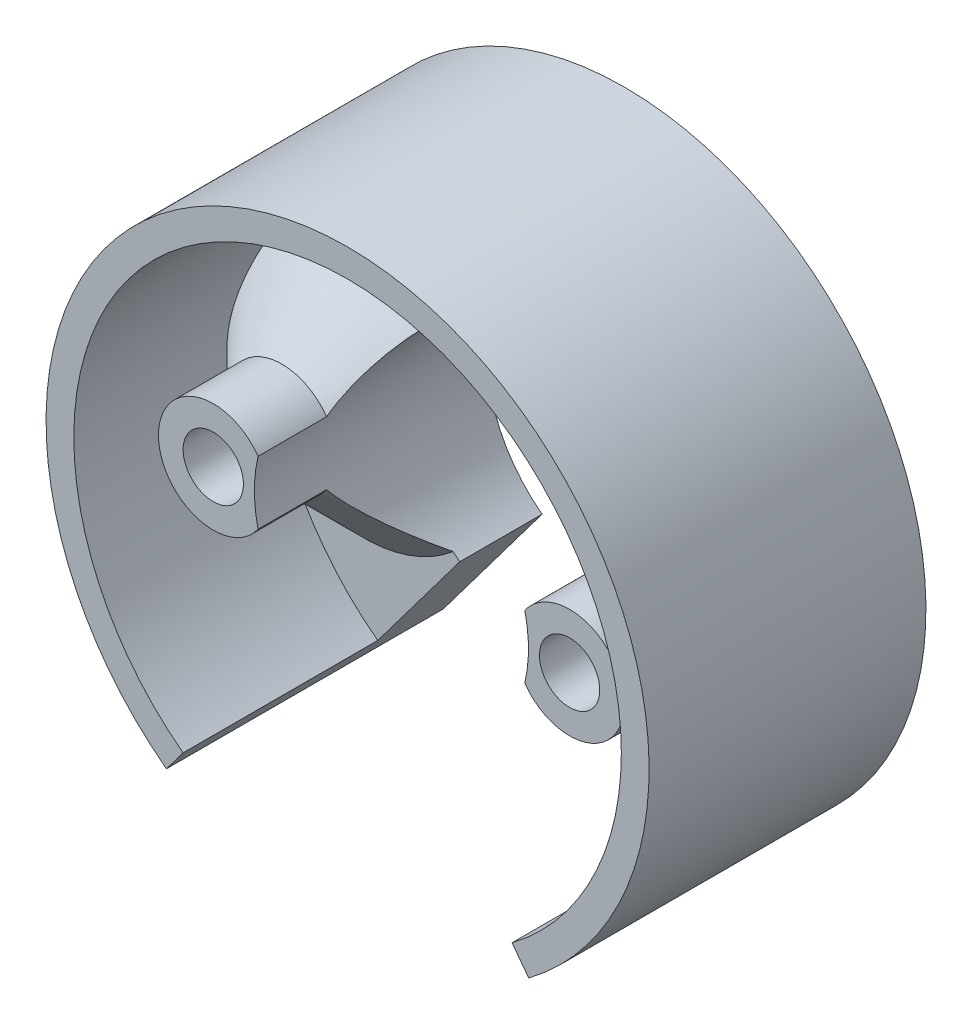
ISO-10303-21;
HEADER;
FILE_DESCRIPTION(('STEP AP214'),'2;1');
FILE_NAME('part.step','',(''),(''),'','','');
FILE_SCHEMA(('AUTOMOTIVE_DESIGN { 1 0 10303 214 1 1 1 1 }'));
ENDSEC;
DATA;
#1=APPLICATION_CONTEXT('core data for automotive mechanical design processes');
#2=APPLICATION_PROTOCOL_DEFINITION('international standard','automotive_design',2000,#1);
#3=PRODUCT_CONTEXT('',#1,'mechanical');
#4=PRODUCT('Part','Part','',(#3));
#5=PRODUCT_RELATED_PRODUCT_CATEGORY('part','',(#4));
#6=PRODUCT_DEFINITION_FORMATION('','',#4);
#7=PRODUCT_DEFINITION_CONTEXT('part definition',#1,'design');
#8=PRODUCT_DEFINITION('design','',#6,#7);
#9=PRODUCT_DEFINITION_SHAPE('','',#8);
#10=(LENGTH_UNIT() NAMED_UNIT(*) SI_UNIT(.MILLI.,.METRE.));
#11=(NAMED_UNIT(*) PLANE_ANGLE_UNIT() SI_UNIT($,.RADIAN.));
#12=(NAMED_UNIT(*) SI_UNIT($,.STERADIAN.) SOLID_ANGLE_UNIT());
#13=UNCERTAINTY_MEASURE_WITH_UNIT(LENGTH_MEASURE(1.E-05),#10,'distance_accuracy_value','');
#14=(GEOMETRIC_REPRESENTATION_CONTEXT(3) GLOBAL_UNCERTAINTY_ASSIGNED_CONTEXT((#13)) GLOBAL_UNIT_ASSIGNED_CONTEXT((#10,
#11,#12)) REPRESENTATION_CONTEXT('',''));
#15=CARTESIAN_POINT('',(0.,0.,0.));
#16=DIRECTION('',(0.,0.,1.));
#17=DIRECTION('',(1.,0.,0.));
#18=AXIS2_PLACEMENT_3D('',#15,#16,#17);
#19=CARTESIAN_POINT('',(0.,0.,3.));
#20=DIRECTION('',(0.,0.,1.));
#21=DIRECTION('',(1.,0.,0.));
#22=AXIS2_PLACEMENT_3D('',#19,#20,#21);
#23=PLANE('',#22);
#24=DIRECTION('',(-0.600761748195803,-0.799428121787521,0.));
#25=VECTOR('',#24,1.);
#26=CARTESIAN_POINT('',(0.,0.,3.));
#27=LINE('',#26,#25);
#28=CARTESIAN_POINT('',(-3.00380874097901,-3.9971406089376,3.));
#29=VERTEX_POINT('',#28);
#30=CARTESIAN_POINT('',(-5.99999999999994,-7.98414470483524,3.));
#31=VERTEX_POINT('',#30);
#32=EDGE_CURVE('E321',#29,#31,#27,.T.);
#33=ORIENTED_EDGE('',*,*,#32,.F.);
#34=CARTESIAN_POINT('',(0.,0.,3.));
#35=DIRECTION('',(0.,0.,1.));
#36=DIRECTION('',(1.,0.,0.));
#37=AXIS2_PLACEMENT_3D('',#34,#35,#36);
#38=CIRCLE('',#37,5.);
#39=CARTESIAN_POINT('',(-3.24999999999998,-3.79967103839268,3.));
#40=VERTEX_POINT('',#39);
#41=EDGE_CURVE('E182',#40,#29,#38,.T.);
#42=ORIENTED_EDGE('',*,*,#41,.F.);
#43=CARTESIAN_POINT('',(-6.5,0.,3.));
#44=DIRECTION('',(0.,0.,1.));
#45=DIRECTION('',(1.,0.,0.));
#46=AXIS2_PLACEMENT_3D('',#43,#44,#45);
#47=CIRCLE('',#46,5.00000000000002);
#48=CARTESIAN_POINT('',(-8.99973589751906,-4.33027948782232,3.));
#49=VERTEX_POINT('',#48);
#50=EDGE_CURVE('E199',#40,#49,#47,.F.);
#51=ORIENTED_EDGE('',*,*,#50,.T.);
#52=CARTESIAN_POINT('',(0.,0.,3.));
#53=DIRECTION('',(0.,0.,-1.));
#54=DIRECTION('',(1.,0.,0.));
#55=AXIS2_PLACEMENT_3D('',#52,#53,#54);
#56=CIRCLE('',#55,9.987320294641);
#57=EDGE_CURVE('E323',#31,#49,#56,.T.);
#58=ORIENTED_EDGE('',*,*,#57,.F.);
#59=EDGE_LOOP('',(#33,#42,#51,#58));
#60=FACE_BOUND('',#59,.T.);
#61=ADVANCED_FACE('F45',(#60),#23,.T.);
#62=CARTESIAN_POINT('',(3.24999999999998,3.79967103839268,3.));
#63=VERTEX_POINT('',#62);
#64=CARTESIAN_POINT('',(-3.24999999999998,3.79967103839268,3.));
#65=VERTEX_POINT('',#64);
#66=EDGE_CURVE('E184',#63,#65,#38,.T.);
#67=ORIENTED_EDGE('',*,*,#66,.F.);
#68=CARTESIAN_POINT('',(6.5,0.,3.));
#69=DIRECTION('',(0.,0.,1.));
#70=DIRECTION('',(1.,0.,0.));
#71=AXIS2_PLACEMENT_3D('',#68,#69,#70);
#72=CIRCLE('',#71,5.00000000000002);
#73=CARTESIAN_POINT('',(8.99973589751906,4.33027948782232,3.));
#74=VERTEX_POINT('',#73);
#75=EDGE_CURVE('E206',#63,#74,#72,.F.);
#76=ORIENTED_EDGE('',*,*,#75,.T.);
#77=CARTESIAN_POINT('',(-8.99973589751906,4.33027948782232,3.));
#78=VERTEX_POINT('',#77);
#79=EDGE_CURVE('E315',#78,#74,#56,.T.);
#80=ORIENTED_EDGE('',*,*,#79,.F.);
#81=CARTESIAN_POINT('',(-6.5,0.,3.));
#82=DIRECTION('',(0.,0.,1.));
#83=DIRECTION('',(1.,0.,0.));
#84=AXIS2_PLACEMENT_3D('',#81,#82,#83);
#85=CIRCLE('',#84,5.00000000000002);
#86=EDGE_CURVE('E196',#78,#65,#85,.F.);
#87=ORIENTED_EDGE('',*,*,#86,.T.);
#88=EDGE_LOOP('',(#67,#76,#80,#87));
#89=FACE_BOUND('',#88,.T.);
#90=ADVANCED_FACE('F411',(#89),#23,.T.);
#91=DIRECTION('',(-0.600761748195808,0.799428121787517,0.));
#92=VECTOR('',#91,1.);
#93=CARTESIAN_POINT('',(0.,0.,3.));
#94=LINE('',#93,#92);
#95=CARTESIAN_POINT('',(6.,-7.9841447048352,3.));
#96=VERTEX_POINT('',#95);
#97=CARTESIAN_POINT('',(3.00380874097904,-3.99714060893758,3.));
#98=VERTEX_POINT('',#97);
#99=EDGE_CURVE('E76',#96,#98,#94,.T.);
#100=ORIENTED_EDGE('',*,*,#99,.F.);
#101=CARTESIAN_POINT('',(8.99973589751906,-4.33027948782232,3.));
#102=VERTEX_POINT('',#101);
#103=EDGE_CURVE('E313',#102,#96,#56,.T.);
#104=ORIENTED_EDGE('',*,*,#103,.F.);
#105=CARTESIAN_POINT('',(6.5,0.,3.));
#106=DIRECTION('',(0.,0.,1.));
#107=DIRECTION('',(1.,0.,0.));
#108=AXIS2_PLACEMENT_3D('',#105,#106,#107);
#109=CIRCLE('',#108,5.00000000000002);
#110=CARTESIAN_POINT('',(3.24999999999998,-3.79967103839268,3.));
#111=VERTEX_POINT('',#110);
#112=EDGE_CURVE('E202',#102,#111,#109,.F.);
#113=ORIENTED_EDGE('',*,*,#112,.T.);
#114=EDGE_CURVE('E176',#98,#111,#38,.T.);
#115=ORIENTED_EDGE('',*,*,#114,.F.);
#116=EDGE_LOOP('',(#100,#104,#113,#115));
#117=FACE_BOUND('',#116,.T.);
#118=ADVANCED_FACE('F261',(#117),#23,.T.);
#119=CARTESIAN_POINT('',(0.,0.,0.));
#120=DIRECTION('',(0.,0.,1.));
#121=DIRECTION('',(1.,0.,0.));
#122=AXIS2_PLACEMENT_3D('',#119,#120,#121);
#123=PLANE('',#122);
#124=CARTESIAN_POINT('',(0.,0.,0.));
#125=DIRECTION('',(0.,0.,1.));
#126=DIRECTION('',(1.,0.,0.));
#127=AXIS2_PLACEMENT_3D('',#124,#125,#126);
#128=CIRCLE('',#127,5.);
#129=CARTESIAN_POINT('',(3.00380874097904,-3.99714060893758,0.));
#130=VERTEX_POINT('',#129);
#131=CARTESIAN_POINT('',(-3.00380874097901,-3.9971406089376,0.));
#132=VERTEX_POINT('',#131);
#133=EDGE_CURVE('E167',#130,#132,#128,.T.);
#134=ORIENTED_EDGE('',*,*,#133,.T.);
#135=DIRECTION('',(0.600761748195802,0.799428121787521,0.));
#136=VECTOR('',#135,1.);
#137=CARTESIAN_POINT('',(0.,0.,0.));
#138=LINE('',#137,#136);
#139=CARTESIAN_POINT('',(-6.60837923015383,-8.79370933966273,0.));
#140=VERTEX_POINT('',#139);
#141=EDGE_CURVE('E68',#140,#132,#138,.T.);
#142=ORIENTED_EDGE('',*,*,#141,.F.);
#143=CARTESIAN_POINT('',(0.,0.,0.));
#144=DIRECTION('',(0.,0.,1.));
#145=DIRECTION('',(1.,0.,0.));
#146=AXIS2_PLACEMENT_3D('',#143,#144,#145);
#147=CIRCLE('',#146,11.);
#148=CARTESIAN_POINT('',(6.60837923015389,-8.79370933966268,0.));
#149=VERTEX_POINT('',#148);
#150=EDGE_CURVE('E169',#149,#140,#147,.T.);
#151=ORIENTED_EDGE('',*,*,#150,.F.);
#152=DIRECTION('',(0.600761748195808,-0.799428121787517,0.));
#153=VECTOR('',#152,1.);
#154=CARTESIAN_POINT('',(0.,0.,0.));
#155=LINE('',#154,#153);
#156=EDGE_CURVE('E155',#130,#149,#155,.T.);
#157=ORIENTED_EDGE('',*,*,#156,.F.);
#158=EDGE_LOOP('',(#134,#142,#151,#157));
#159=FACE_BOUND('',#158,.T.);
#160=CARTESIAN_POINT('',(-6.5,0.,0.));
#161=DIRECTION('',(0.,0.,1.));
#162=DIRECTION('',(1.,0.,0.));
#163=AXIS2_PLACEMENT_3D('',#160,#161,#162);
#164=CIRCLE('',#163,1.1);
#165=CARTESIAN_POINT('',(-5.4,0.,0.));
#166=VERTEX_POINT('',#165);
#167=EDGE_CURVE('E177',#166,#166,#164,.T.);
#168=ORIENTED_EDGE('',*,*,#167,.T.);
#169=EDGE_LOOP('',(#168));
#170=FACE_BOUND('',#169,.T.);
#171=CARTESIAN_POINT('',(6.5,0.,0.));
#172=DIRECTION('',(0.,0.,1.));
#173=DIRECTION('',(1.,0.,0.));
#174=AXIS2_PLACEMENT_3D('',#171,#172,#173);
#175=CIRCLE('',#174,1.1);
#176=CARTESIAN_POINT('',(7.6,0.,0.));
#177=VERTEX_POINT('',#176);
#178=EDGE_CURVE('E187',#177,#177,#175,.T.);
#179=ORIENTED_EDGE('',*,*,#178,.T.);
#180=EDGE_LOOP('',(#179));
#181=FACE_BOUND('',#180,.T.);
#182=ADVANCED_FACE('F165',(#159,#170,#181),#123,.F.);
#183=CARTESIAN_POINT('',(0.,0.,3.));
#184=DIRECTION('',(0.,0.,-1.));
#185=DIRECTION('',(-1.,0.,0.));
#186=AXIS2_PLACEMENT_3D('',#183,#184,#185);
#187=CYLINDRICAL_SURFACE('',#186,11.);
#188=ORIENTED_EDGE('',*,*,#150,.T.);
#189=DIRECTION('',(0.,0.,-1.));
#190=VECTOR('',#189,1.);
#191=CARTESIAN_POINT('',(-6.60837923015389,-8.79370933966268,10.1));
#192=LINE('',#191,#190);
#193=CARTESIAN_POINT('',(-6.60837923015389,-8.79370933966268,10.1));
#194=VERTEX_POINT('',#193);
#195=EDGE_CURVE('E383',#194,#140,#192,.T.);
#196=ORIENTED_EDGE('',*,*,#195,.F.);
#197=CARTESIAN_POINT('',(0.,0.,10.1));
#198=DIRECTION('',(0.,0.,1.));
#199=DIRECTION('',(1.,0.,0.));
#200=AXIS2_PLACEMENT_3D('',#197,#198,#199);
#201=CIRCLE('',#200,11.);
#202=CARTESIAN_POINT('',(6.60837923015389,-8.79370933966268,10.1));
#203=VERTEX_POINT('',#202);
#204=EDGE_CURVE('E361',#203,#194,#201,.T.);
#205=ORIENTED_EDGE('',*,*,#204,.F.);
#206=DIRECTION('',(0.,0.,-1.));
#207=VECTOR('',#206,1.);
#208=CARTESIAN_POINT('',(6.60837923015389,-8.79370933966268,10.1));
#209=LINE('',#208,#207);
#210=EDGE_CURVE('E373',#203,#149,#209,.T.);
#211=ORIENTED_EDGE('',*,*,#210,.T.);
#212=EDGE_LOOP('',(#188,#196,#205,#211));
#213=FACE_BOUND('',#212,.T.);
#214=ADVANCED_FACE('F260',(#213),#187,.T.);
#215=CARTESIAN_POINT('',(0.,0.,3.));
#216=DIRECTION('',(0.,0.,-1.));
#217=DIRECTION('',(-1.,0.,0.));
#218=AXIS2_PLACEMENT_3D('',#215,#216,#217);
#219=CYLINDRICAL_SURFACE('',#218,5.);
#220=DIRECTION('',(0.,0.,-1.));
#221=VECTOR('',#220,1.);
#222=CARTESIAN_POINT('',(-3.00380874097901,-3.9971406089376,10.));
#223=LINE('',#222,#221);
#224=EDGE_CURVE('E161',#29,#132,#223,.T.);
#225=ORIENTED_EDGE('',*,*,#224,.T.);
#226=ORIENTED_EDGE('',*,*,#133,.F.);
#227=DIRECTION('',(0.,0.,-1.));
#228=VECTOR('',#227,1.);
#229=CARTESIAN_POINT('',(3.00380874097904,-3.99714060893758,10.));
#230=LINE('',#229,#228);
#231=EDGE_CURVE('E151',#98,#130,#230,.T.);
#232=ORIENTED_EDGE('',*,*,#231,.F.);
#233=ORIENTED_EDGE('',*,*,#114,.T.);
#234=CARTESIAN_POINT('',(3.24999999999998,-3.79967103839268,3.));
#235=CARTESIAN_POINT('',(3.31760602021216,-3.74184321252924,3.08788616162119));
#236=CARTESIAN_POINT('',(3.38354345836514,-3.68232198830534,3.1759241669716));
#237=CARTESIAN_POINT('',(3.51199944060858,-3.56001797404654,3.35222888387647));
#238=CARTESIAN_POINT('',(3.57451798486796,-3.49723518417279,3.44049559541962));
#239=CARTESIAN_POINT('',(3.75687393840086,-3.30412803550893,3.70560083192215));
#240=CARTESIAN_POINT('',(3.87145451622359,-3.16909387480187,3.88267021670122));
#241=CARTESIAN_POINT('',(4.08384424779871,-2.89005062852266,4.23302608860814));
#242=CARTESIAN_POINT('',(4.1819334010978,-2.74626390062699,4.406319877048));
#243=CARTESIAN_POINT('',(4.3180177202173,-2.52236785028849,4.66485177316896));
#244=CARTESIAN_POINT('',(4.36153499144014,-2.44637198868528,4.75078844148804));
#245=CARTESIAN_POINT('',(4.44482783822175,-2.29155727558712,4.92192411196014));
#246=CARTESIAN_POINT('',(4.48460379131815,-2.21273871004281,5.00712318775437));
#247=CARTESIAN_POINT('',(4.55785514464445,-2.05738661910028,5.17084124015878));
#248=CARTESIAN_POINT('',(4.59157270637921,-1.98104249508576,5.24943172456402));
#249=CARTESIAN_POINT('',(4.65559262768488,-1.82552200341731,5.40513084501972));
#250=CARTESIAN_POINT('',(4.68589651070962,-1.74634692011148,5.48224012925259));
#251=CARTESIAN_POINT('',(4.72885768869272,-1.62473782851321,5.59660137317794));
#252=CARTESIAN_POINT('',(4.74282011893764,-1.58353275859239,5.63467507951544));
#253=CARTESIAN_POINT('',(4.7698359301542,-1.50019467633801,5.71011893964536));
#254=CARTESIAN_POINT('',(4.78288938008276,-1.45806173471441,5.74748914664926));
#255=CARTESIAN_POINT('',(4.80807993917729,-1.37271687278439,5.82139387289693));
#256=CARTESIAN_POINT('',(4.82021608902512,-1.32950388410516,5.85792749015052));
#257=CARTESIAN_POINT('',(4.84352888997359,-1.24188348177952,5.92987230653889));
#258=CARTESIAN_POINT('',(4.8547052968318,-1.19747576784455,5.96528321852163));
#259=CARTESIAN_POINT('',(4.86538461538463,-1.15240294358304,6.00000000000011));
#260=B_SPLINE_CURVE_WITH_KNOTS('',3,(#234,#235,#236,#237,#238,#239,#240,#241,#242,#243,#244,
#245,#246,#247,#248,#249,#250,#251,#252,#253,#254,#255,#256,#257,#258,#259),.UNSPECIFIED.,.F.,
.F.,(4,2,2,2,2,2,2,2,2,2,2,2,4),(0.,0.375116764830293,0.750233511126938,1.50078334502235,
2.23690883678732,2.60492121844114,2.97289642391581,3.31672718752836,3.66040389357613,
3.83382953665474,4.00724200897719,4.18083339742028,4.35446883255692),.UNSPECIFIED.);
#261=CARTESIAN_POINT('',(4.86538461538461,-1.15240294358297,6.00000000000005));
#262=VERTEX_POINT('',#261);
#263=EDGE_CURVE('E273',#111,#262,#260,.T.);
#264=ORIENTED_EDGE('',*,*,#263,.T.);
#265=DIRECTION('',(0.,0.,-1.));
#266=VECTOR('',#265,1.);
#267=CARTESIAN_POINT('',(4.86538461538461,-1.15240294358297,8.5));
#268=LINE('',#267,#266);
#269=CARTESIAN_POINT('',(4.86538461538461,-1.15240294358297,8.5));
#270=VERTEX_POINT('',#269);
#271=EDGE_CURVE('E329',#270,#262,#268,.T.);
#272=ORIENTED_EDGE('',*,*,#271,.F.);
#273=CARTESIAN_POINT('',(0.,0.,8.5));
#274=DIRECTION('',(0.,0.,-1.));
#275=DIRECTION('',(1.,0.,0.));
#276=AXIS2_PLACEMENT_3D('',#273,#274,#275);
#277=CIRCLE('',#276,5.);
#278=CARTESIAN_POINT('',(4.86538461538461,1.15240294358297,8.5));
#279=VERTEX_POINT('',#278);
#280=EDGE_CURVE('E331',#279,#270,#277,.T.);
#281=ORIENTED_EDGE('',*,*,#280,.F.);
#282=DIRECTION('',(0.,0.,-1.));
#283=VECTOR('',#282,1.);
#284=CARTESIAN_POINT('',(4.86538461538461,1.15240294358297,8.5));
#285=LINE('',#284,#283);
#286=CARTESIAN_POINT('',(4.86538461538461,1.15240294358297,6.00000000000005));
#287=VERTEX_POINT('',#286);
#288=EDGE_CURVE('E327',#279,#287,#285,.T.);
#289=ORIENTED_EDGE('',*,*,#288,.T.);
#290=CARTESIAN_POINT('',(4.86538461538461,1.15240294358297,6.00000000000005));
#291=CARTESIAN_POINT('',(4.85666874846538,1.18919486511631,5.97166993095488));
#292=CARTESIAN_POINT('',(4.84762110268823,1.22553909889845,5.94287067726912));
#293=CARTESIAN_POINT('',(4.82888170570585,1.29741421029686,5.88448903351356));
#294=CARTESIAN_POINT('',(4.81919006098167,1.33294522107458,5.85490677339306));
#295=CARTESIAN_POINT('',(4.78918637227833,1.43841523011025,5.76524149311673));
#296=CARTESIAN_POINT('',(4.76793459269001,1.50727714538455,5.70420405016701));
#297=CARTESIAN_POINT('',(4.72305641778763,1.64249898267645,5.58047690181129));
#298=CARTESIAN_POINT('',(4.69943340413765,1.70886228726208,5.51778964085392));
#299=CARTESIAN_POINT('',(4.6498475546972,1.83950995651555,5.39116969129651));
#300=CARTESIAN_POINT('',(4.6238843005448,1.90379394666462,5.327236781621));
#301=CARTESIAN_POINT('',(4.54331632301094,2.09207137099102,5.13591667275861));
#302=CARTESIAN_POINT('',(4.48540125510619,2.21336940464067,5.00725329119695));
#303=CARTESIAN_POINT('',(4.36093102529069,2.44950579945845,4.74812015962299));
#304=CARTESIAN_POINT('',(4.2943722694846,2.5643414450513,4.61764967852114));
#305=CARTESIAN_POINT('',(4.15728184276057,2.78071340260311,4.36401294574114));
#306=CARTESIAN_POINT('',(4.08725709372787,2.88263246328362,4.2408988198785));
#307=CARTESIAN_POINT('',(3.9400497353427,3.08078477126456,3.99443618699191));
#308=CARTESIAN_POINT('',(3.86286886415137,3.17701939001926,3.8710877439742));
#309=CARTESIAN_POINT('',(3.70049906372417,3.36480513905538,3.62288873118914));
#310=CARTESIAN_POINT('',(3.61521935373222,3.45627945569276,3.49803940030966));
#311=CARTESIAN_POINT('',(3.43773677897362,3.63285376266675,3.24868331154885));
#312=CARTESIAN_POINT('',(3.34553192560978,3.71795190792525,3.12417666279271));
#313=CARTESIAN_POINT('',(3.24999999999997,3.79967103839269,3.00000000000002));
#314=B_SPLINE_CURVE_WITH_KNOTS('',3,(#290,#291,#292,#293,#294,#295,#296,#297,#298,#299,#300,
#301,#302,#303,#304,#305,#306,#307,#308,#309,#310,#311,#312,#313),.UNSPECIFIED.,.F.,.F.,(4,2,2,
2,2,2,2,2,2,2,2,4),(0.,0.141723523437728,0.283423671841019,0.566646152542504,0.849470312717236,
1.13234513368094,1.69016775581147,2.24822305794793,2.77146261020098,3.29457540330164,
3.82446423337607,4.35450581034724),.UNSPECIFIED.);
#315=EDGE_CURVE('E266',#287,#63,#314,.T.);
#316=ORIENTED_EDGE('',*,*,#315,.T.);
#317=ORIENTED_EDGE('',*,*,#66,.T.);
#318=CARTESIAN_POINT('',(-3.24999999999998,3.79967103839268,3.));
#319=CARTESIAN_POINT('',(-3.31760602021216,3.74184321252924,3.08788616162119));
#320=CARTESIAN_POINT('',(-3.38354345836514,3.68232198830533,3.1759241669716));
#321=CARTESIAN_POINT('',(-3.51199944060858,3.56001797404654,3.35222888387646));
#322=CARTESIAN_POINT('',(-3.57451798486796,3.49723518417279,3.44049559541962));
#323=CARTESIAN_POINT('',(-3.75687393840086,3.30412803550893,3.70560083192215));
#324=CARTESIAN_POINT('',(-3.87145451622359,3.16909387480187,3.88267021670122));
#325=CARTESIAN_POINT('',(-4.08384424779871,2.89005062852265,4.23302608860814));
#326=CARTESIAN_POINT('',(-4.1819334010978,2.74626390062699,4.406319877048));
#327=CARTESIAN_POINT('',(-4.3180177202173,2.52236785028849,4.66485177316896));
#328=CARTESIAN_POINT('',(-4.36153499144014,2.44637198868528,4.75078844148804));
#329=CARTESIAN_POINT('',(-4.44482783822175,2.29155727558712,4.92192411196015));
#330=CARTESIAN_POINT('',(-4.48460379131815,2.21273871004281,5.00712318775437));
#331=CARTESIAN_POINT('',(-4.55785514464444,2.05738661910028,5.17084124015878));
#332=CARTESIAN_POINT('',(-4.59157270637921,1.98104249508576,5.24943172456402));
#333=CARTESIAN_POINT('',(-4.65559262768488,1.82552200341731,5.40513084501972));
#334=CARTESIAN_POINT('',(-4.68589651070962,1.74634692011148,5.48224012925259));
#335=CARTESIAN_POINT('',(-4.72885768869272,1.62473782851321,5.59660137317794));
#336=CARTESIAN_POINT('',(-4.74282011893764,1.58353275859239,5.63467507951544));
#337=CARTESIAN_POINT('',(-4.7698359301542,1.50019467633801,5.71011893964536));
#338=CARTESIAN_POINT('',(-4.78288938008276,1.45806173471441,5.74748914664926));
#339=CARTESIAN_POINT('',(-4.80807993917729,1.37271687278439,5.82139387289693));
#340=CARTESIAN_POINT('',(-4.82021608902512,1.32950388410516,5.85792749015052));
#341=CARTESIAN_POINT('',(-4.84352888997359,1.24188348177952,5.92987230653889));
#342=CARTESIAN_POINT('',(-4.8547052968318,1.19747576784455,5.96528321852163));
#343=CARTESIAN_POINT('',(-4.86538461538463,1.15240294358304,6.00000000000011));
#344=B_SPLINE_CURVE_WITH_KNOTS('',3,(#318,#319,#320,#321,#322,#323,#324,#325,#326,#327,#328,
#329,#330,#331,#332,#333,#334,#335,#336,#337,#338,#339,#340,#341,#342,#343),.UNSPECIFIED.,.F.,
.F.,(4,2,2,2,2,2,2,2,2,2,2,2,4),(0.,0.375116764830293,0.750233511126938,1.50078334502235,
2.23690883678732,2.60492121844114,2.97289642391581,3.31672718752837,3.66040389357613,
3.83382953665474,4.00724200897719,4.18083339742028,4.35446883255692),.UNSPECIFIED.);
#345=CARTESIAN_POINT('',(-4.86538461538461,1.15240294358297,6.00000000000005));
#346=VERTEX_POINT('',#345);
#347=EDGE_CURVE('E11',#65,#346,#344,.T.);
#348=ORIENTED_EDGE('',*,*,#347,.T.);
#349=DIRECTION('',(0.,0.,-1.));
#350=VECTOR('',#349,1.);
#351=CARTESIAN_POINT('',(-4.86538461538461,1.15240294358297,8.5));
#352=LINE('',#351,#350);
#353=CARTESIAN_POINT('',(-4.86538461538461,1.15240294358297,8.5));
#354=VERTEX_POINT('',#353);
#355=EDGE_CURVE('E393',#354,#346,#352,.T.);
#356=ORIENTED_EDGE('',*,*,#355,.F.);
#357=CARTESIAN_POINT('',(0.,0.,8.5));
#358=DIRECTION('',(0.,0.,-1.));
#359=DIRECTION('',(1.,0.,0.));
#360=AXIS2_PLACEMENT_3D('',#357,#358,#359);
#361=CIRCLE('',#360,5.);
#362=CARTESIAN_POINT('',(-4.86538461538461,-1.15240294358297,8.5));
#363=VERTEX_POINT('',#362);
#364=EDGE_CURVE('E385',#363,#354,#361,.T.);
#365=ORIENTED_EDGE('',*,*,#364,.F.);
#366=DIRECTION('',(0.,0.,-1.));
#367=VECTOR('',#366,1.);
#368=CARTESIAN_POINT('',(-4.86538461538461,-1.15240294358297,8.5));
#369=LINE('',#368,#367);
#370=CARTESIAN_POINT('',(-4.86538461538461,-1.15240294358297,6.00000000000005));
#371=VERTEX_POINT('',#370);
#372=EDGE_CURVE('E391',#363,#371,#369,.T.);
#373=ORIENTED_EDGE('',*,*,#372,.T.);
#374=CARTESIAN_POINT('',(-4.86538461538461,-1.15240294358297,6.00000000000005));
#375=CARTESIAN_POINT('',(-4.85666874846538,-1.18919486511631,5.97166993095488));
#376=CARTESIAN_POINT('',(-4.84762110268823,-1.22553909889845,5.94287067726912));
#377=CARTESIAN_POINT('',(-4.82888170570585,-1.29741421029686,5.88448903351356));
#378=CARTESIAN_POINT('',(-4.81919006098167,-1.33294522107458,5.85490677339306));
#379=CARTESIAN_POINT('',(-4.78918637227833,-1.43841523011025,5.76524149311673));
#380=CARTESIAN_POINT('',(-4.76793459269001,-1.50727714538455,5.70420405016701));
#381=CARTESIAN_POINT('',(-4.72305641778763,-1.64249898267645,5.58047690181129));
#382=CARTESIAN_POINT('',(-4.69943340413765,-1.70886228726208,5.51778964085392));
#383=CARTESIAN_POINT('',(-4.6498475546972,-1.83950995651555,5.39116969129651));
#384=CARTESIAN_POINT('',(-4.6238843005448,-1.90379394666462,5.327236781621));
#385=CARTESIAN_POINT('',(-4.54331632301094,-2.09207137099102,5.13591667275861));
#386=CARTESIAN_POINT('',(-4.48540125510619,-2.21336940464067,5.00725329119695));
#387=CARTESIAN_POINT('',(-4.36093102529069,-2.44950579945845,4.74812015962299));
#388=CARTESIAN_POINT('',(-4.2943722694846,-2.5643414450513,4.61764967852114));
#389=CARTESIAN_POINT('',(-4.15728184276057,-2.78071340260311,4.36401294574114));
#390=CARTESIAN_POINT('',(-4.08725709372787,-2.88263246328362,4.2408988198785));
#391=CARTESIAN_POINT('',(-3.9400497353427,-3.08078477126456,3.99443618699191));
#392=CARTESIAN_POINT('',(-3.86286886415137,-3.17701939001926,3.8710877439742));
#393=CARTESIAN_POINT('',(-3.70049906372417,-3.36480513905538,3.62288873118914));
#394=CARTESIAN_POINT('',(-3.61521935373222,-3.45627945569276,3.49803940030966));
#395=CARTESIAN_POINT('',(-3.43773677897362,-3.63285376266675,3.24868331154885));
#396=CARTESIAN_POINT('',(-3.34553192560978,-3.71795190792525,3.12417666279271));
#397=CARTESIAN_POINT('',(-3.24999999999997,-3.79967103839269,3.00000000000002));
#398=B_SPLINE_CURVE_WITH_KNOTS('',3,(#374,#375,#376,#377,#378,#379,#380,#381,#382,#383,#384,
#385,#386,#387,#388,#389,#390,#391,#392,#393,#394,#395,#396,#397),.UNSPECIFIED.,.F.,.F.,(4,2,2,
2,2,2,2,2,2,2,2,4),(0.,0.141723523437728,0.283423671841019,0.566646152542504,0.849470312717236,
1.13234513368094,1.69016775581147,2.24822305794793,2.77146261020098,3.29457540330164,
3.82446423337608,4.35450581034724),.UNSPECIFIED.);
#399=EDGE_CURVE('E61',#371,#40,#398,.T.);
#400=ORIENTED_EDGE('',*,*,#399,.T.);
#401=ORIENTED_EDGE('',*,*,#41,.T.);
#402=EDGE_LOOP('',(#225,#226,#232,#233,#264,#272,#281,#289,#316,#317,#348,#356,#365,#373,#400,#401));
#403=FACE_BOUND('',#402,.T.);
#404=ADVANCED_FACE('F173',(#403),#219,.F.);
#405=CARTESIAN_POINT('',(-6.5,0.,3.));
#406=DIRECTION('',(0.,0.,-1.));
#407=DIRECTION('',(-1.,0.,0.));
#408=AXIS2_PLACEMENT_3D('',#405,#406,#407);
#409=CYLINDRICAL_SURFACE('',#408,1.1);
#410=ORIENTED_EDGE('',*,*,#167,.F.);
#411=EDGE_LOOP('',(#410));
#412=FACE_BOUND('',#411,.T.);
#413=CARTESIAN_POINT('',(-6.5,0.,8.5));
#414=DIRECTION('',(0.,0.,1.));
#415=DIRECTION('',(1.,0.,0.));
#416=AXIS2_PLACEMENT_3D('',#413,#414,#415);
#417=CIRCLE('',#416,1.1);
#418=CARTESIAN_POINT('',(-5.4,0.,8.5));
#419=VERTEX_POINT('',#418);
#420=EDGE_CURVE('E171',#419,#419,#417,.F.);
#421=ORIENTED_EDGE('',*,*,#420,.F.);
#422=EDGE_LOOP('',(#421));
#423=FACE_BOUND('',#422,.T.);
#424=ADVANCED_FACE('F253',(#412,#423),#409,.F.);
#425=CARTESIAN_POINT('',(6.5,0.,3.));
#426=DIRECTION('',(0.,0.,-1.));
#427=DIRECTION('',(-1.,0.,0.));
#428=AXIS2_PLACEMENT_3D('',#425,#426,#427);
#429=CYLINDRICAL_SURFACE('',#428,1.1);
#430=ORIENTED_EDGE('',*,*,#178,.F.);
#431=EDGE_LOOP('',(#430));
#432=FACE_BOUND('',#431,.T.);
#433=CARTESIAN_POINT('',(6.5,0.,8.5));
#434=DIRECTION('',(0.,0.,1.));
#435=DIRECTION('',(1.,0.,0.));
#436=AXIS2_PLACEMENT_3D('',#433,#434,#435);
#437=CIRCLE('',#436,1.1);
#438=CARTESIAN_POINT('',(7.6,0.,8.5));
#439=VERTEX_POINT('',#438);
#440=EDGE_CURVE('E347',#439,#439,#437,.F.);
#441=ORIENTED_EDGE('',*,*,#440,.F.);
#442=EDGE_LOOP('',(#441));
#443=FACE_BOUND('',#442,.T.);
#444=ADVANCED_FACE('F246',(#432,#443),#429,.F.);
#445=CARTESIAN_POINT('',(3.25,0.,8.5));
#446=DIRECTION('',(0.,0.,1.));
#447=DIRECTION('',(1.,0.,0.));
#448=AXIS2_PLACEMENT_3D('',#445,#446,#447);
#449=PLANE('',#448);
#450=ORIENTED_EDGE('',*,*,#440,.T.);
#451=EDGE_LOOP('',(#450));
#452=FACE_BOUND('',#451,.T.);
#453=ORIENTED_EDGE('',*,*,#280,.T.);
#454=CARTESIAN_POINT('',(6.5,0.,8.5));
#455=DIRECTION('',(0.,0.,1.));
#456=DIRECTION('',(1.,0.,0.));
#457=AXIS2_PLACEMENT_3D('',#454,#455,#456);
#458=CIRCLE('',#457,2.);
#459=EDGE_CURVE('E333',#270,#279,#458,.T.);
#460=ORIENTED_EDGE('',*,*,#459,.T.);
#461=EDGE_LOOP('',(#453,#460));
#462=FACE_BOUND('',#461,.T.);
#463=ADVANCED_FACE('F243',(#452,#462),#449,.T.);
#464=CARTESIAN_POINT('',(6.5,0.,8.5));
#465=DIRECTION('',(0.,0.,-1.));
#466=DIRECTION('',(-1.,0.,0.));
#467=AXIS2_PLACEMENT_3D('',#464,#465,#466);
#468=CYLINDRICAL_SURFACE('',#467,2.);
#469=ORIENTED_EDGE('',*,*,#271,.T.);
#470=CARTESIAN_POINT('',(6.5,0.,6.00000000000005));
#471=DIRECTION('',(0.,0.,1.));
#472=DIRECTION('',(1.,0.,0.));
#473=AXIS2_PLACEMENT_3D('',#470,#471,#472);
#474=CIRCLE('',#473,2.);
#475=EDGE_CURVE('E192',#262,#287,#474,.T.);
#476=ORIENTED_EDGE('',*,*,#475,.T.);
#477=ORIENTED_EDGE('',*,*,#288,.F.);
#478=ORIENTED_EDGE('',*,*,#459,.F.);
#479=EDGE_LOOP('',(#469,#476,#477,#478));
#480=FACE_BOUND('',#479,.T.);
#481=ADVANCED_FACE('F241',(#480),#468,.T.);
#482=CARTESIAN_POINT('',(-6.5,0.,8.5));
#483=DIRECTION('',(0.,0.,-1.));
#484=DIRECTION('',(-1.,0.,0.));
#485=AXIS2_PLACEMENT_3D('',#482,#483,#484);
#486=CYLINDRICAL_SURFACE('',#485,2.);
#487=ORIENTED_EDGE('',*,*,#355,.T.);
#488=CARTESIAN_POINT('',(-6.5,0.,6.00000000000005));
#489=DIRECTION('',(0.,0.,1.));
#490=DIRECTION('',(1.,0.,0.));
#491=AXIS2_PLACEMENT_3D('',#488,#489,#490);
#492=CIRCLE('',#491,2.);
#493=EDGE_CURVE('E293',#346,#371,#492,.T.);
#494=ORIENTED_EDGE('',*,*,#493,.T.);
#495=ORIENTED_EDGE('',*,*,#372,.F.);
#496=CARTESIAN_POINT('',(-6.5,0.,8.5));
#497=DIRECTION('',(0.,0.,1.));
#498=DIRECTION('',(1.,0.,0.));
#499=AXIS2_PLACEMENT_3D('',#496,#497,#498);
#500=CIRCLE('',#499,2.);
#501=EDGE_CURVE('E389',#354,#363,#500,.T.);
#502=ORIENTED_EDGE('',*,*,#501,.F.);
#503=EDGE_LOOP('',(#487,#494,#495,#502));
#504=FACE_BOUND('',#503,.T.);
#505=ADVANCED_FACE('F237',(#504),#486,.T.);
#506=CARTESIAN_POINT('',(-3.25,0.,8.5));
#507=DIRECTION('',(0.,0.,1.));
#508=DIRECTION('',(1.,0.,0.));
#509=AXIS2_PLACEMENT_3D('',#506,#507,#508);
#510=PLANE('',#509);
#511=ORIENTED_EDGE('',*,*,#420,.T.);
#512=EDGE_LOOP('',(#511));
#513=FACE_BOUND('',#512,.T.);
#514=ORIENTED_EDGE('',*,*,#364,.T.);
#515=ORIENTED_EDGE('',*,*,#501,.T.);
#516=EDGE_LOOP('',(#514,#515));
#517=FACE_BOUND('',#516,.T.);
#518=ADVANCED_FACE('F234',(#513,#517),#510,.T.);
#519=CARTESIAN_POINT('',(-6.60837923015389,-8.79370933966268,10.1));
#520=DIRECTION('',(-0.799428121787516,0.600761748195808,0.));
#521=DIRECTION('',(-0.600761748195808,-0.799428121787516,0.));
#522=AXIS2_PLACEMENT_3D('',#519,#520,#521);
#523=PLANE('',#522);
#524=ORIENTED_EDGE('',*,*,#32,.T.);
#525=DIRECTION('',(0.,0.,-1.));
#526=VECTOR('',#525,1.);
#527=CARTESIAN_POINT('',(-6.,-7.9841447048352,10.1));
#528=LINE('',#527,#526);
#529=CARTESIAN_POINT('',(-6.,-7.9841447048352,10.1));
#530=VERTEX_POINT('',#529);
#531=EDGE_CURVE('E380',#530,#31,#528,.T.);
#532=ORIENTED_EDGE('',*,*,#531,.F.);
#533=DIRECTION('',(0.600761748195808,0.799428121787516,0.));
#534=VECTOR('',#533,1.);
#535=CARTESIAN_POINT('',(-6.60837923015389,-8.79370933966268,10.1));
#536=LINE('',#535,#534);
#537=EDGE_CURVE('E365',#194,#530,#536,.T.);
#538=ORIENTED_EDGE('',*,*,#537,.F.);
#539=ORIENTED_EDGE('',*,*,#195,.T.);
#540=ORIENTED_EDGE('',*,*,#141,.T.);
#541=ORIENTED_EDGE('',*,*,#224,.F.);
#542=EDGE_LOOP('',(#524,#532,#538,#539,#540,#541));
#543=FACE_BOUND('',#542,.T.);
#544=ADVANCED_FACE('F228',(#543),#523,.F.);
#545=CARTESIAN_POINT('',(0.,0.,10.1));
#546=DIRECTION('',(0.,0.,-1.));
#547=DIRECTION('',(-1.,0.,0.));
#548=AXIS2_PLACEMENT_3D('',#545,#546,#547);
#549=CYLINDRICAL_SURFACE('',#548,9.987320294641);
#550=ORIENTED_EDGE('',*,*,#79,.T.);
#551=CARTESIAN_POINT('',(8.99973589751906,4.33027948782232,3.));
#552=CARTESIAN_POINT('',(9.0458550509851,4.23442351838975,3.05994870658732));
#553=CARTESIAN_POINT('',(9.09061501273177,4.13748316583909,3.11922102545536));
#554=CARTESIAN_POINT('',(9.17734801232333,3.94136536571112,3.23613133888716));
#555=CARTESIAN_POINT('',(9.21932046745411,3.84218745615278,3.29376899029817));
#556=CARTESIAN_POINT('',(9.30056281757518,3.64114001037103,3.40734390799116));
#557=CARTESIAN_POINT('',(9.33982047485319,3.53926082994009,3.4632729110636));
#558=CARTESIAN_POINT('',(9.4153364414824,3.33317365250725,3.57278895628811));
#559=CARTESIAN_POINT('',(9.4515949145192,3.22896578299233,3.62637612617434));
#560=CARTESIAN_POINT('',(9.5573692896548,2.90773470378565,3.78548487813059));
#561=CARTESIAN_POINT('',(9.62195144989841,2.68684573078676,3.88662858980892));
#562=CARTESIAN_POINT('',(9.73683217948542,2.23491853407486,4.07235827203057));
#563=CARTESIAN_POINT('',(9.78715654924721,2.00389952786515,4.15697406361368));
#564=CARTESIAN_POINT('',(9.85422020074812,1.63103045305441,4.27259770719413));
#565=CARTESIAN_POINT('',(9.87618938417829,1.49246446953726,4.31119745075814));
#566=CARTESIAN_POINT('',(9.91447670280476,1.21230955191327,4.37929173043755));
#567=CARTESIAN_POINT('',(9.93079502034076,1.07072071550308,4.408786560343));
#568=CARTESIAN_POINT('',(9.95732359511634,0.786429324488607,4.45712747187145));
#569=CARTESIAN_POINT('',(9.96758589291809,0.643747259445929,4.47606420107033));
#570=CARTESIAN_POINT('',(9.98196875024837,0.357020551466933,4.50269331997699));
#571=CARTESIAN_POINT('',(9.98608970612042,0.212975997065382,4.51038643531278));
#572=CARTESIAN_POINT('',(9.9880822895518,-0.0761532960521885,4.51409961972834));
#573=CARTESIAN_POINT('',(9.98591721656105,-0.221239190184357,4.51005113643531));
#574=CARTESIAN_POINT('',(9.97532010447905,-0.510383174706866,4.49037056742621));
#575=CARTESIAN_POINT('',(9.96688780846061,-0.654441222715814,4.47473800681655));
#576=CARTESIAN_POINT('',(9.94392632898052,-0.941098653836212,4.43265323105962));
#577=CARTESIAN_POINT('',(9.92937066869608,-1.08368891402159,4.40615404238965));
#578=CARTESIAN_POINT('',(9.89448339289143,-1.36602062389815,4.34360037080528));
#579=CARTESIAN_POINT('',(9.87415090065178,-1.50576163772145,4.30754443756973));
#580=CARTESIAN_POINT('',(9.81697864167064,-1.84837201914004,4.20798773115678));
#581=CARTESIAN_POINT('',(9.77690236540359,-2.0492908479481,4.13962636954968));
#582=CARTESIAN_POINT('',(9.68591691076268,-2.44347362086499,3.98935301778048));
#583=CARTESIAN_POINT('',(9.63500044052068,-2.63673230791326,3.9074319146896));
#584=CARTESIAN_POINT('',(9.52317668057075,-3.01574644683845,3.73352139746785));
#585=CARTESIAN_POINT('',(9.46226421834283,-3.20149795170507,3.64152677894575));
#586=CARTESIAN_POINT('',(9.3311419675361,-3.56563959824689,3.45017900471947));
#587=CARTESIAN_POINT('',(9.26093644594469,-3.74403306941365,3.35082923536708));
#588=CARTESIAN_POINT('',(9.15657417904992,-3.98866673166474,3.20805171571987));
#589=CARTESIAN_POINT('',(9.1261176365591,-4.05785988224762,3.16690954273824));
#590=CARTESIAN_POINT('',(9.06390843244034,-4.19497104565432,3.083957731978));
#591=CARTESIAN_POINT('',(9.03215938718321,-4.26289193155627,3.04215013233442));
#592=CARTESIAN_POINT('',(8.99973589751908,-4.33027948782233,3.));
#593=B_SPLINE_CURVE_WITH_KNOTS('',3,(#551,#552,#553,#554,#555,#556,#557,#558,#559,#560,#561,
#562,#563,#564,#565,#566,#567,#568,#569,#570,#571,#572,#573,#574,#575,#576,#577,#578,#579,#580,
#581,#582,#583,#584,#585,#586,#587,#588,#589,#590,#591,#592),.UNSPECIFIED.,.F.,.F.,(4,2,2,2,2,2,
2,2,2,2,2,2,2,2,2,2,2,2,2,2,4),(0.,0.366303359388726,0.732683053161215,1.10061910663773,
1.46853506610847,2.22172288284607,2.97353892172634,3.40971206872775,3.845871140172,
4.27822547433521,4.71055190445644,5.14540750941403,5.58028094242653,6.01705437202196,
6.4538941238663,7.1007597521282,7.74806188980102,8.39570004239067,9.04304185127701,
9.30123466132408,9.5587489716671),.UNSPECIFIED.);
#594=EDGE_CURVE('E217',#74,#102,#593,.T.);
#595=ORIENTED_EDGE('',*,*,#594,.T.);
#596=ORIENTED_EDGE('',*,*,#103,.T.);
#597=DIRECTION('',(0.,0.,-1.));
#598=VECTOR('',#597,1.);
#599=CARTESIAN_POINT('',(6.,-7.9841447048352,10.1));
#600=LINE('',#599,#598);
#601=CARTESIAN_POINT('',(6.,-7.9841447048352,10.1));
#602=VERTEX_POINT('',#601);
#603=EDGE_CURVE('E378',#602,#96,#600,.T.);
#604=ORIENTED_EDGE('',*,*,#603,.F.);
#605=CARTESIAN_POINT('',(0.,0.,10.1));
#606=DIRECTION('',(0.,0.,-1.));
#607=DIRECTION('',(1.,0.,0.));
#608=AXIS2_PLACEMENT_3D('',#605,#606,#607);
#609=CIRCLE('',#608,9.987320294641);
#610=EDGE_CURVE('E368',#530,#602,#609,.T.);
#611=ORIENTED_EDGE('',*,*,#610,.F.);
#612=ORIENTED_EDGE('',*,*,#531,.T.);
#613=ORIENTED_EDGE('',*,*,#57,.T.);
#614=CARTESIAN_POINT('',(-8.99973589751906,-4.33027948782232,3.));
#615=CARTESIAN_POINT('',(-9.0458550509851,-4.23442351838975,3.05994870658732));
#616=CARTESIAN_POINT('',(-9.09061501273177,-4.13748316583909,3.11922102545536));
#617=CARTESIAN_POINT('',(-9.17734801232333,-3.94136536571112,3.23613133888716));
#618=CARTESIAN_POINT('',(-9.21932046745411,-3.84218745615278,3.29376899029817));
#619=CARTESIAN_POINT('',(-9.30056281757518,-3.64114001037103,3.40734390799116));
#620=CARTESIAN_POINT('',(-9.33982047485319,-3.53926082994009,3.4632729110636));
#621=CARTESIAN_POINT('',(-9.4153364414824,-3.33317365250725,3.57278895628811));
#622=CARTESIAN_POINT('',(-9.4515949145192,-3.22896578299233,3.62637612617434));
#623=CARTESIAN_POINT('',(-9.5573692896548,-2.90773470378565,3.78548487813059));
#624=CARTESIAN_POINT('',(-9.62195144989841,-2.68684573078676,3.88662858980892));
#625=CARTESIAN_POINT('',(-9.73683217948542,-2.23491853407486,4.07235827203057));
#626=CARTESIAN_POINT('',(-9.78715654924721,-2.00389952786515,4.15697406361368));
#627=CARTESIAN_POINT('',(-9.85422020074812,-1.63103045305441,4.27259770719413));
#628=CARTESIAN_POINT('',(-9.87618938417829,-1.49246446953726,4.31119745075814));
#629=CARTESIAN_POINT('',(-9.91447670280476,-1.21230955191327,4.37929173043755));
#630=CARTESIAN_POINT('',(-9.93079502034076,-1.07072071550308,4.408786560343));
#631=CARTESIAN_POINT('',(-9.95732359511634,-0.786429324488607,4.45712747187145));
#632=CARTESIAN_POINT('',(-9.96758589291809,-0.643747259445929,4.47606420107033));
#633=CARTESIAN_POINT('',(-9.98196875024837,-0.357020551466933,4.50269331997699));
#634=CARTESIAN_POINT('',(-9.98608970612042,-0.212975997065382,4.51038643531278));
#635=CARTESIAN_POINT('',(-9.9880822895518,0.0761532960521885,4.51409961972834));
#636=CARTESIAN_POINT('',(-9.98591721656105,0.221239190184357,4.51005113643531));
#637=CARTESIAN_POINT('',(-9.97532010447905,0.510383174706866,4.49037056742621));
#638=CARTESIAN_POINT('',(-9.96688780846061,0.654441222715814,4.47473800681655));
#639=CARTESIAN_POINT('',(-9.94392632898052,0.941098653836212,4.43265323105962));
#640=CARTESIAN_POINT('',(-9.92937066869608,1.08368891402159,4.40615404238965));
#641=CARTESIAN_POINT('',(-9.89448339289143,1.36602062389815,4.34360037080528));
#642=CARTESIAN_POINT('',(-9.87415090065178,1.50576163772145,4.30754443756973));
#643=CARTESIAN_POINT('',(-9.81697864167064,1.84837201914004,4.20798773115678));
#644=CARTESIAN_POINT('',(-9.77690236540359,2.0492908479481,4.13962636954968));
#645=CARTESIAN_POINT('',(-9.68591691076268,2.44347362086499,3.98935301778048));
#646=CARTESIAN_POINT('',(-9.63500044052068,2.63673230791326,3.9074319146896));
#647=CARTESIAN_POINT('',(-9.52317668057075,3.01574644683845,3.73352139746785));
#648=CARTESIAN_POINT('',(-9.46226421834283,3.20149795170507,3.64152677894575));
#649=CARTESIAN_POINT('',(-9.3311419675361,3.56563959824689,3.45017900471947));
#650=CARTESIAN_POINT('',(-9.26093644594469,3.74403306941365,3.35082923536708));
#651=CARTESIAN_POINT('',(-9.15657417904992,3.98866673166474,3.20805171571987));
#652=CARTESIAN_POINT('',(-9.1261176365591,4.05785988224762,3.16690954273824));
#653=CARTESIAN_POINT('',(-9.06390843244034,4.19497104565432,3.083957731978));
#654=CARTESIAN_POINT('',(-9.03215938718321,4.26289193155627,3.04215013233442));
#655=CARTESIAN_POINT('',(-8.99973589751908,4.33027948782233,3.));
#656=B_SPLINE_CURVE_WITH_KNOTS('',3,(#614,#615,#616,#617,#618,#619,#620,#621,#622,#623,#624,
#625,#626,#627,#628,#629,#630,#631,#632,#633,#634,#635,#636,#637,#638,#639,#640,#641,#642,#643,
#644,#645,#646,#647,#648,#649,#650,#651,#652,#653,#654,#655),.UNSPECIFIED.,.F.,.F.,(4,2,2,2,2,2,
2,2,2,2,2,2,2,2,2,2,2,2,2,2,4),(0.,0.366303359388726,0.732683053161215,1.10061910663773,
1.46853506610847,2.22172288284607,2.97353892172634,3.40971206872775,3.845871140172,
4.27822547433521,4.71055190445644,5.14540750941403,5.58028094242653,6.01705437202196,
6.4538941238663,7.1007597521282,7.74806188980102,8.39570004239067,9.04304185127701,
9.30123466132408,9.5587489716671),.UNSPECIFIED.);
#657=EDGE_CURVE('E209',#49,#78,#656,.T.);
#658=ORIENTED_EDGE('',*,*,#657,.T.);
#659=EDGE_LOOP('',(#550,#595,#596,#604,#611,#612,#613,#658));
#660=FACE_BOUND('',#659,.T.);
#661=ADVANCED_FACE('F223',(#660),#549,.F.);
#662=CARTESIAN_POINT('',(6.60837923015389,-8.79370933966268,10.1));
#663=DIRECTION('',(0.799428121787516,0.600761748195808,0.));
#664=DIRECTION('',(-0.600761748195808,0.799428121787516,0.));
#665=AXIS2_PLACEMENT_3D('',#662,#663,#664);
#666=PLANE('',#665);
#667=ORIENTED_EDGE('',*,*,#156,.T.);
#668=ORIENTED_EDGE('',*,*,#210,.F.);
#669=DIRECTION('',(0.600761748195808,-0.799428121787516,0.));
#670=VECTOR('',#669,1.);
#671=CARTESIAN_POINT('',(6.60837923015389,-8.79370933966268,10.1));
#672=LINE('',#671,#670);
#673=EDGE_CURVE('E371',#602,#203,#672,.T.);
#674=ORIENTED_EDGE('',*,*,#673,.F.);
#675=ORIENTED_EDGE('',*,*,#603,.T.);
#676=ORIENTED_EDGE('',*,*,#99,.T.);
#677=ORIENTED_EDGE('',*,*,#231,.T.);
#678=EDGE_LOOP('',(#667,#668,#674,#675,#676,#677));
#679=FACE_BOUND('',#678,.T.);
#680=ADVANCED_FACE('F153',(#679),#666,.F.);
#681=CARTESIAN_POINT('',(0.,0.,10.1));
#682=DIRECTION('',(0.,0.,1.));
#683=DIRECTION('',(1.,0.,0.));
#684=AXIS2_PLACEMENT_3D('',#681,#682,#683);
#685=PLANE('',#684);
#686=ORIENTED_EDGE('',*,*,#204,.T.);
#687=ORIENTED_EDGE('',*,*,#537,.T.);
#688=ORIENTED_EDGE('',*,*,#610,.T.);
#689=ORIENTED_EDGE('',*,*,#673,.T.);
#690=EDGE_LOOP('',(#686,#687,#688,#689));
#691=FACE_BOUND('',#690,.T.);
#692=ADVANCED_FACE('F471',(#691),#685,.T.);
#693=CARTESIAN_POINT('',(6.5,0.,6.00000000000005));
#694=DIRECTION('',(0.,0.,-1.));
#695=DIRECTION('',(-1.,0.,0.));
#696=AXIS2_PLACEMENT_3D('',#693,#694,#695);
#697=CONICAL_SURFACE('',#696,2.,0.785398163397443);
#698=ORIENTED_EDGE('',*,*,#594,.F.);
#699=ORIENTED_EDGE('',*,*,#75,.F.);
#700=ORIENTED_EDGE('',*,*,#315,.F.);
#701=ORIENTED_EDGE('',*,*,#475,.F.);
#702=ORIENTED_EDGE('',*,*,#263,.F.);
#703=ORIENTED_EDGE('',*,*,#112,.F.);
#704=EDGE_LOOP('',(#698,#699,#700,#701,#702,#703));
#705=FACE_BOUND('',#704,.T.);
#706=ADVANCED_FACE('F324',(#705),#697,.T.);
#707=CARTESIAN_POINT('',(-6.5,0.,6.00000000000005));
#708=DIRECTION('',(0.,0.,-1.));
#709=DIRECTION('',(-1.,0.,0.));
#710=AXIS2_PLACEMENT_3D('',#707,#708,#709);
#711=CONICAL_SURFACE('',#710,2.,0.785398163397443);
#712=ORIENTED_EDGE('',*,*,#657,.F.);
#713=ORIENTED_EDGE('',*,*,#50,.F.);
#714=ORIENTED_EDGE('',*,*,#399,.F.);
#715=ORIENTED_EDGE('',*,*,#493,.F.);
#716=ORIENTED_EDGE('',*,*,#347,.F.);
#717=ORIENTED_EDGE('',*,*,#86,.F.);
#718=EDGE_LOOP('',(#712,#713,#714,#715,#716,#717));
#719=FACE_BOUND('',#718,.T.);
#720=ADVANCED_FACE('F48',(#719),#711,.T.);
#721=CLOSED_SHELL('',(#61,#90,#118,#182,#214,#404,#424,#444,#463,#481,#505,#518,#544,#661,#680,
#692,#706,#720));
#722=MANIFOLD_SOLID_BREP('B2',#721);
#723=ADVANCED_BREP_SHAPE_REPRESENTATION('',(#18,#722),#14);
#724=SHAPE_DEFINITION_REPRESENTATION(#9,#723);
ENDSEC;
END-ISO-10303-21;
